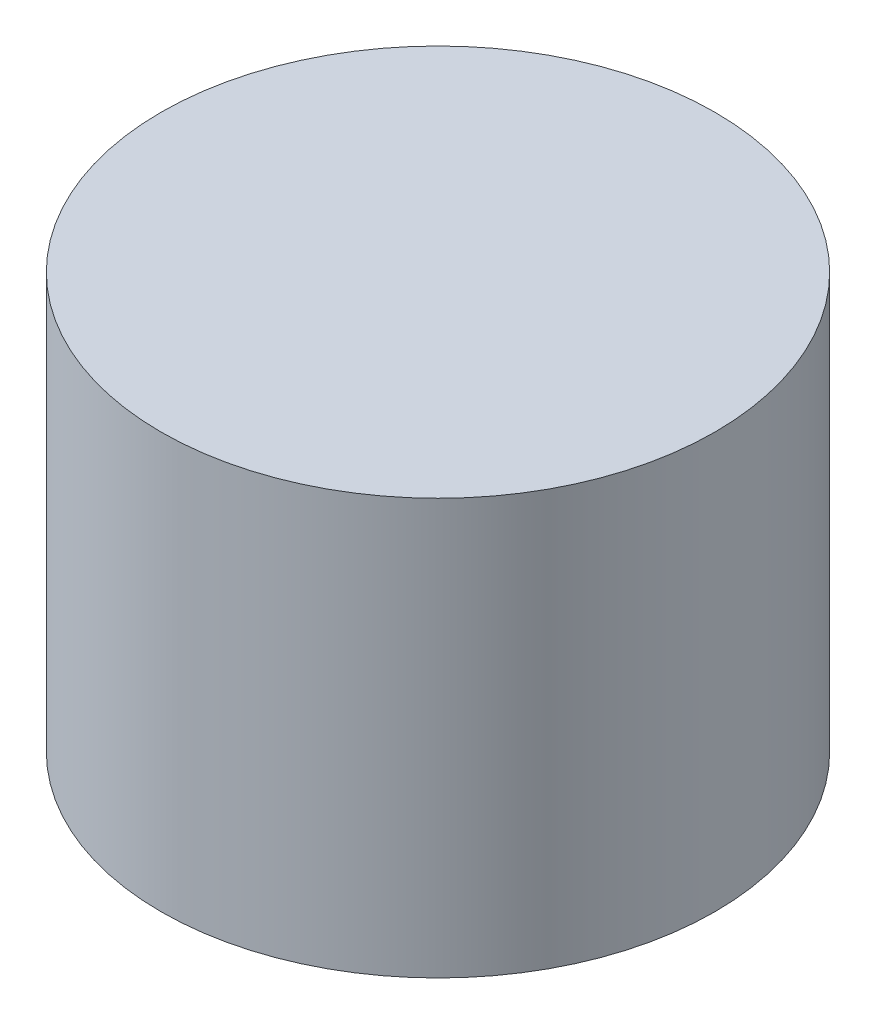
ISO-10303-21;
HEADER;
FILE_DESCRIPTION(('STEP AP214'),'2;1');
FILE_NAME('part.step','',(''),(''),'','','');
FILE_SCHEMA(('AUTOMOTIVE_DESIGN { 1 0 10303 214 1 1 1 1 }'));
ENDSEC;
DATA;
#1=APPLICATION_CONTEXT('core data for automotive mechanical design processes');
#2=APPLICATION_PROTOCOL_DEFINITION('international standard','automotive_design',2000,#1);
#3=PRODUCT_CONTEXT('',#1,'mechanical');
#4=PRODUCT('Part','Part','',(#3));
#5=PRODUCT_RELATED_PRODUCT_CATEGORY('part','',(#4));
#6=PRODUCT_DEFINITION_FORMATION('','',#4);
#7=PRODUCT_DEFINITION_CONTEXT('part definition',#1,'design');
#8=PRODUCT_DEFINITION('design','',#6,#7);
#9=PRODUCT_DEFINITION_SHAPE('','',#8);
#10=(LENGTH_UNIT() NAMED_UNIT(*) SI_UNIT(.MILLI.,.METRE.));
#11=(NAMED_UNIT(*) PLANE_ANGLE_UNIT() SI_UNIT($,.RADIAN.));
#12=(NAMED_UNIT(*) SI_UNIT($,.STERADIAN.) SOLID_ANGLE_UNIT());
#13=UNCERTAINTY_MEASURE_WITH_UNIT(LENGTH_MEASURE(1.E-05),#10,'distance_accuracy_value','');
#14=(GEOMETRIC_REPRESENTATION_CONTEXT(3) GLOBAL_UNCERTAINTY_ASSIGNED_CONTEXT((#13)) GLOBAL_UNIT_ASSIGNED_CONTEXT((#10,
#11,#12)) REPRESENTATION_CONTEXT('',''));
#15=CARTESIAN_POINT('',(0.,0.,0.));
#16=DIRECTION('',(0.,0.,1.));
#17=DIRECTION('',(1.,0.,0.));
#18=AXIS2_PLACEMENT_3D('',#15,#16,#17);
#19=CARTESIAN_POINT('',(0.,15.,0.));
#20=DIRECTION('',(0.,-1.,0.));
#21=DIRECTION('',(0.,0.,-1.));
#22=AXIS2_PLACEMENT_3D('',#19,#20,#21);
#23=CYLINDRICAL_SURFACE('',#22,10.);
#24=CARTESIAN_POINT('',(0.,15.,0.));
#25=DIRECTION('',(0.,1.,0.));
#26=DIRECTION('',(0.,0.,1.));
#27=AXIS2_PLACEMENT_3D('',#24,#25,#26);
#28=CIRCLE('',#27,10.);
#29=CARTESIAN_POINT('',(0.,15.,10.));
#30=VERTEX_POINT('',#29);
#31=EDGE_CURVE('E10',#30,#30,#28,.T.);
#32=ORIENTED_EDGE('',*,*,#31,.F.);
#33=EDGE_LOOP('',(#32));
#34=FACE_BOUND('',#33,.T.);
#35=CARTESIAN_POINT('',(0.,0.,0.));
#36=DIRECTION('',(0.,1.,0.));
#37=DIRECTION('',(0.,0.,1.));
#38=AXIS2_PLACEMENT_3D('',#35,#36,#37);
#39=CIRCLE('',#38,10.);
#40=CARTESIAN_POINT('',(0.,0.,10.));
#41=VERTEX_POINT('',#40);
#42=EDGE_CURVE('E44',#41,#41,#39,.T.);
#43=ORIENTED_EDGE('',*,*,#42,.T.);
#44=EDGE_LOOP('',(#43));
#45=FACE_BOUND('',#44,.T.);
#46=ADVANCED_FACE('F41',(#34,#45),#23,.T.);
#47=CARTESIAN_POINT('',(0.,15.,0.));
#48=DIRECTION('',(0.,1.,0.));
#49=DIRECTION('',(0.,0.,1.));
#50=AXIS2_PLACEMENT_3D('',#47,#48,#49);
#51=PLANE('',#50);
#52=ORIENTED_EDGE('',*,*,#31,.T.);
#53=EDGE_LOOP('',(#52));
#54=FACE_BOUND('',#53,.T.);
#55=ADVANCED_FACE('F56',(#54),#51,.T.);
#56=CARTESIAN_POINT('',(0.,0.,0.));
#57=DIRECTION('',(0.,1.,0.));
#58=DIRECTION('',(0.,0.,1.));
#59=AXIS2_PLACEMENT_3D('',#56,#57,#58);
#60=PLANE('',#59);
#61=ORIENTED_EDGE('',*,*,#42,.F.);
#62=EDGE_LOOP('',(#61));
#63=FACE_BOUND('',#62,.T.);
#64=ADVANCED_FACE('F54',(#63),#60,.F.);
#65=CLOSED_SHELL('',(#46,#55,#64));
#66=MANIFOLD_SOLID_BREP('B2',#65);
#67=ADVANCED_BREP_SHAPE_REPRESENTATION('',(#18,#66),#14);
#68=SHAPE_DEFINITION_REPRESENTATION(#9,#67);
ENDSEC;
END-ISO-10303-21;
